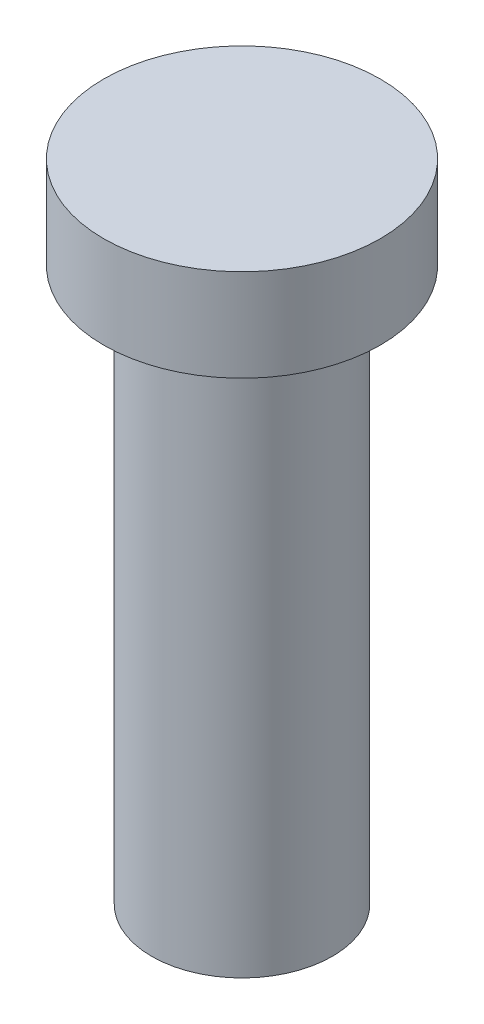
ISO-10303-21;
HEADER;
FILE_DESCRIPTION(('STEP AP214'),'2;1');
FILE_NAME('part.step','',(''),(''),'','','');
FILE_SCHEMA(('AUTOMOTIVE_DESIGN { 1 0 10303 214 1 1 1 1 }'));
ENDSEC;
DATA;
#1=APPLICATION_CONTEXT('core data for automotive mechanical design processes');
#2=APPLICATION_PROTOCOL_DEFINITION('international standard','automotive_design',2000,#1);
#3=PRODUCT_CONTEXT('',#1,'mechanical');
#4=PRODUCT('Part','Part','',(#3));
#5=PRODUCT_RELATED_PRODUCT_CATEGORY('part','',(#4));
#6=PRODUCT_DEFINITION_FORMATION('','',#4);
#7=PRODUCT_DEFINITION_CONTEXT('part definition',#1,'design');
#8=PRODUCT_DEFINITION('design','',#6,#7);
#9=PRODUCT_DEFINITION_SHAPE('','',#8);
#10=(LENGTH_UNIT() NAMED_UNIT(*) SI_UNIT(.MILLI.,.METRE.));
#11=(NAMED_UNIT(*) PLANE_ANGLE_UNIT() SI_UNIT($,.RADIAN.));
#12=(NAMED_UNIT(*) SI_UNIT($,.STERADIAN.) SOLID_ANGLE_UNIT());
#13=UNCERTAINTY_MEASURE_WITH_UNIT(LENGTH_MEASURE(1.E-05),#10,'distance_accuracy_value','');
#14=(GEOMETRIC_REPRESENTATION_CONTEXT(3) GLOBAL_UNCERTAINTY_ASSIGNED_CONTEXT((#13)) GLOBAL_UNIT_ASSIGNED_CONTEXT((#10,
#11,#12)) REPRESENTATION_CONTEXT('',''));
#15=CARTESIAN_POINT('',(0.,0.,0.));
#16=DIRECTION('',(0.,0.,1.));
#17=DIRECTION('',(1.,0.,0.));
#18=AXIS2_PLACEMENT_3D('',#15,#16,#17);
#19=CARTESIAN_POINT('',(0.,60.,0.));
#20=DIRECTION('',(0.,-1.,0.));
#21=DIRECTION('',(0.,0.,-1.));
#22=AXIS2_PLACEMENT_3D('',#19,#20,#21);
#23=CYLINDRICAL_SURFACE('',#22,9.8);
#24=CARTESIAN_POINT('',(0.,60.,0.));
#25=DIRECTION('',(0.,1.,0.));
#26=DIRECTION('',(0.,0.,1.));
#27=AXIS2_PLACEMENT_3D('',#24,#25,#26);
#28=CIRCLE('',#27,9.8);
#29=CARTESIAN_POINT('',(0.,60.,9.8));
#30=VERTEX_POINT('',#29);
#31=EDGE_CURVE('E10',#30,#30,#28,.T.);
#32=ORIENTED_EDGE('',*,*,#31,.F.);
#33=EDGE_LOOP('',(#32));
#34=FACE_BOUND('',#33,.T.);
#35=CARTESIAN_POINT('',(0.,0.,0.));
#36=DIRECTION('',(0.,1.,0.));
#37=DIRECTION('',(0.,0.,1.));
#38=AXIS2_PLACEMENT_3D('',#35,#36,#37);
#39=CIRCLE('',#38,9.8);
#40=CARTESIAN_POINT('',(0.,0.,9.8));
#41=VERTEX_POINT('',#40);
#42=EDGE_CURVE('E36',#41,#41,#39,.T.);
#43=ORIENTED_EDGE('',*,*,#42,.T.);
#44=EDGE_LOOP('',(#43));
#45=FACE_BOUND('',#44,.T.);
#46=ADVANCED_FACE('F33',(#34,#45),#23,.T.);
#47=CARTESIAN_POINT('',(0.,0.,0.));
#48=DIRECTION('',(0.,1.,0.));
#49=DIRECTION('',(0.,0.,1.));
#50=AXIS2_PLACEMENT_3D('',#47,#48,#49);
#51=PLANE('',#50);
#52=ORIENTED_EDGE('',*,*,#42,.F.);
#53=EDGE_LOOP('',(#52));
#54=FACE_BOUND('',#53,.T.);
#55=ADVANCED_FACE('F56',(#54),#51,.F.);
#56=CARTESIAN_POINT('',(0.,70.,0.));
#57=DIRECTION('',(0.,-1.,0.));
#58=DIRECTION('',(0.,0.,-1.));
#59=AXIS2_PLACEMENT_3D('',#56,#57,#58);
#60=CYLINDRICAL_SURFACE('',#59,15.);
#61=CARTESIAN_POINT('',(0.,70.,0.));
#62=DIRECTION('',(0.,1.,0.));
#63=DIRECTION('',(0.,0.,1.));
#64=AXIS2_PLACEMENT_3D('',#61,#62,#63);
#65=CIRCLE('',#64,15.);
#66=CARTESIAN_POINT('',(0.,70.,15.));
#67=VERTEX_POINT('',#66);
#68=EDGE_CURVE('E43',#67,#67,#65,.T.);
#69=ORIENTED_EDGE('',*,*,#68,.F.);
#70=EDGE_LOOP('',(#69));
#71=FACE_BOUND('',#70,.T.);
#72=CARTESIAN_POINT('',(0.,60.,0.));
#73=DIRECTION('',(0.,1.,0.));
#74=DIRECTION('',(0.,0.,1.));
#75=AXIS2_PLACEMENT_3D('',#72,#73,#74);
#76=CIRCLE('',#75,15.);
#77=CARTESIAN_POINT('',(0.,60.,15.));
#78=VERTEX_POINT('',#77);
#79=EDGE_CURVE('E45',#78,#78,#76,.T.);
#80=ORIENTED_EDGE('',*,*,#79,.T.);
#81=EDGE_LOOP('',(#80));
#82=FACE_BOUND('',#81,.T.);
#83=ADVANCED_FACE('F53',(#71,#82),#60,.T.);
#84=CARTESIAN_POINT('',(0.,70.,0.));
#85=DIRECTION('',(0.,1.,0.));
#86=DIRECTION('',(0.,0.,1.));
#87=AXIS2_PLACEMENT_3D('',#84,#85,#86);
#88=PLANE('',#87);
#89=ORIENTED_EDGE('',*,*,#68,.T.);
#90=EDGE_LOOP('',(#89));
#91=FACE_BOUND('',#90,.T.);
#92=ADVANCED_FACE('F51',(#91),#88,.T.);
#93=CARTESIAN_POINT('',(0.,60.,0.));
#94=DIRECTION('',(0.,1.,0.));
#95=DIRECTION('',(0.,0.,1.));
#96=AXIS2_PLACEMENT_3D('',#93,#94,#95);
#97=PLANE('',#96);
#98=ORIENTED_EDGE('',*,*,#31,.T.);
#99=EDGE_LOOP('',(#98));
#100=FACE_BOUND('',#99,.T.);
#101=ORIENTED_EDGE('',*,*,#79,.F.);
#102=EDGE_LOOP('',(#101));
#103=FACE_BOUND('',#102,.T.);
#104=ADVANCED_FACE('F60',(#100,#103),#97,.F.);
#105=CLOSED_SHELL('',(#46,#55,#83,#92,#104));
#106=MANIFOLD_SOLID_BREP('B2',#105);
#107=ADVANCED_BREP_SHAPE_REPRESENTATION('',(#18,#106),#14);
#108=SHAPE_DEFINITION_REPRESENTATION(#9,#107);
ENDSEC;
END-ISO-10303-21;
